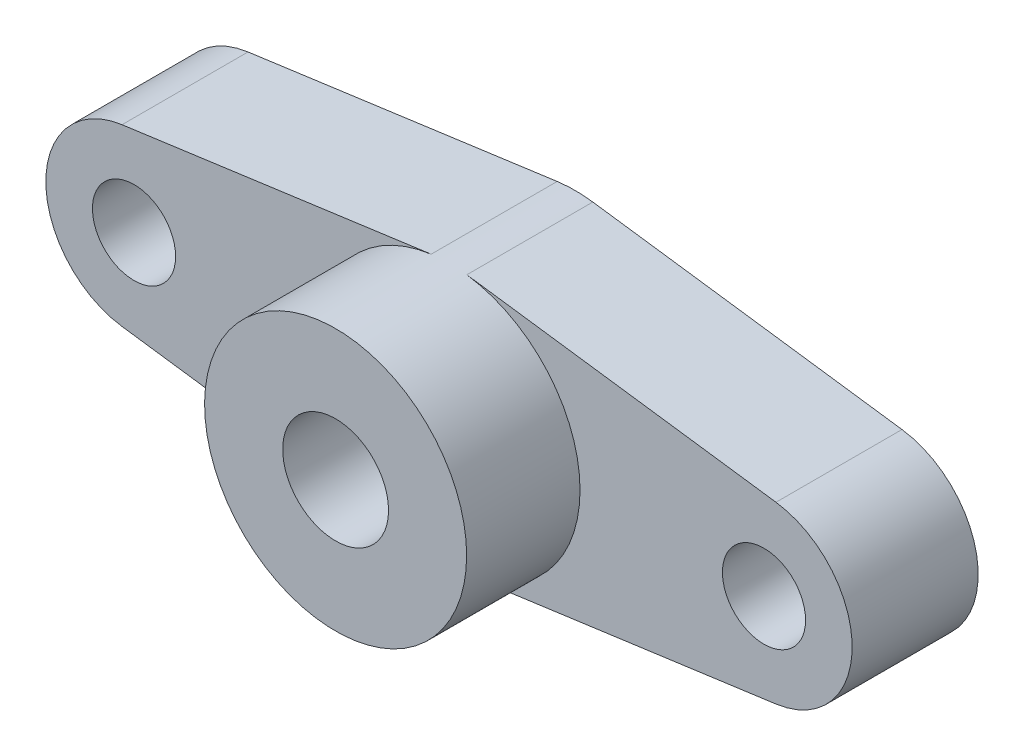
ISO-10303-21;
HEADER;
FILE_DESCRIPTION(('STEP AP214'),'2;1');
FILE_NAME('part.step','',(''),(''),'','','');
FILE_SCHEMA(('AUTOMOTIVE_DESIGN { 1 0 10303 214 1 1 1 1 }'));
ENDSEC;
DATA;
#1=APPLICATION_CONTEXT('core data for automotive mechanical design processes');
#2=APPLICATION_PROTOCOL_DEFINITION('international standard','automotive_design',2000,#1);
#3=PRODUCT_CONTEXT('',#1,'mechanical');
#4=PRODUCT('Part','Part','',(#3));
#5=PRODUCT_RELATED_PRODUCT_CATEGORY('part','',(#4));
#6=PRODUCT_DEFINITION_FORMATION('','',#4);
#7=PRODUCT_DEFINITION_CONTEXT('part definition',#1,'design');
#8=PRODUCT_DEFINITION('design','',#6,#7);
#9=PRODUCT_DEFINITION_SHAPE('','',#8);
#10=(LENGTH_UNIT() NAMED_UNIT(*) SI_UNIT(.MILLI.,.METRE.));
#11=(NAMED_UNIT(*) PLANE_ANGLE_UNIT() SI_UNIT($,.RADIAN.));
#12=(NAMED_UNIT(*) SI_UNIT($,.STERADIAN.) SOLID_ANGLE_UNIT());
#13=UNCERTAINTY_MEASURE_WITH_UNIT(LENGTH_MEASURE(1.E-05),#10,'distance_accuracy_value','');
#14=(GEOMETRIC_REPRESENTATION_CONTEXT(3) GLOBAL_UNCERTAINTY_ASSIGNED_CONTEXT((#13)) GLOBAL_UNIT_ASSIGNED_CONTEXT((#10,
#11,#12)) REPRESENTATION_CONTEXT('',''));
#15=CARTESIAN_POINT('',(0.,0.,0.));
#16=DIRECTION('',(0.,0.,1.));
#17=DIRECTION('',(1.,0.,0.));
#18=AXIS2_PLACEMENT_3D('',#15,#16,#17);
#19=CARTESIAN_POINT('',(0.,0.,0.));
#20=DIRECTION('',(0.,0.,-1.));
#21=DIRECTION('',(-1.,0.,0.));
#22=AXIS2_PLACEMENT_3D('',#19,#20,#21);
#23=PLANE('',#22);
#24=CARTESIAN_POINT('',(0.,0.,0.));
#25=DIRECTION('',(0.,0.,-1.));
#26=DIRECTION('',(-1.,0.,0.));
#27=AXIS2_PLACEMENT_3D('',#24,#25,#26);
#28=CIRCLE('',#27,2.1);
#29=CARTESIAN_POINT('',(-2.1,0.,0.));
#30=VERTEX_POINT('',#29);
#31=EDGE_CURVE('E133',#30,#30,#28,.T.);
#32=ORIENTED_EDGE('',*,*,#31,.F.);
#33=EDGE_LOOP('',(#32));
#34=FACE_BOUND('',#33,.T.);
#35=CARTESIAN_POINT('',(-12.5,0.,0.));
#36=DIRECTION('',(0.,0.,-1.));
#37=DIRECTION('',(-1.,0.,0.));
#38=AXIS2_PLACEMENT_3D('',#35,#36,#37);
#39=CIRCLE('',#38,1.65);
#40=CARTESIAN_POINT('',(-14.15,0.,0.));
#41=VERTEX_POINT('',#40);
#42=EDGE_CURVE('E273',#41,#41,#39,.T.);
#43=ORIENTED_EDGE('',*,*,#42,.F.);
#44=EDGE_LOOP('',(#43));
#45=FACE_BOUND('',#44,.T.);
#46=CARTESIAN_POINT('',(12.5,0.,0.));
#47=DIRECTION('',(0.,0.,-1.));
#48=DIRECTION('',(-1.,0.,0.));
#49=AXIS2_PLACEMENT_3D('',#46,#47,#48);
#50=CIRCLE('',#49,1.65);
#51=CARTESIAN_POINT('',(10.85,0.,0.));
#52=VERTEX_POINT('',#51);
#53=EDGE_CURVE('E217',#52,#52,#50,.T.);
#54=ORIENTED_EDGE('',*,*,#53,.F.);
#55=EDGE_LOOP('',(#54));
#56=FACE_BOUND('',#55,.T.);
#57=DIRECTION('',(-0.990708837146414,0.136,0.));
#58=VECTOR('',#57,1.);
#59=CARTESIAN_POINT('',(0.707199999999998,5.15168595316135,0.));
#60=LINE('',#59,#58);
#61=CARTESIAN_POINT('',(12.976,3.46748093001246,0.));
#62=VERTEX_POINT('',#61);
#63=CARTESIAN_POINT('',(0.707199999999998,5.15168595316135,0.));
#64=VERTEX_POINT('',#63);
#65=EDGE_CURVE('E205',#62,#64,#60,.T.);
#66=ORIENTED_EDGE('',*,*,#65,.F.);
#67=CARTESIAN_POINT('',(12.5,0.,0.));
#68=DIRECTION('',(0.,0.,-1.));
#69=DIRECTION('',(-1.,0.,0.));
#70=AXIS2_PLACEMENT_3D('',#67,#68,#69);
#71=CIRCLE('',#70,3.5);
#72=CARTESIAN_POINT('',(12.976,-3.46748093001244,0.));
#73=VERTEX_POINT('',#72);
#74=EDGE_CURVE('E229',#62,#73,#71,.T.);
#75=ORIENTED_EDGE('',*,*,#74,.T.);
#76=DIRECTION('',(-0.990708837146414,-0.136,0.));
#77=VECTOR('',#76,1.);
#78=CARTESIAN_POINT('',(0.707200000000002,-5.15168595316135,0.));
#79=LINE('',#78,#77);
#80=CARTESIAN_POINT('',(0.707200000000002,-5.15168595316135,0.));
#81=VERTEX_POINT('',#80);
#82=EDGE_CURVE('E12',#73,#81,#79,.T.);
#83=ORIENTED_EDGE('',*,*,#82,.T.);
#84=CARTESIAN_POINT('',(0.,0.,0.));
#85=DIRECTION('',(0.,0.,-1.));
#86=DIRECTION('',(-1.,0.,0.));
#87=AXIS2_PLACEMENT_3D('',#84,#85,#86);
#88=CIRCLE('',#87,5.2);
#89=CARTESIAN_POINT('',(-0.7072,-5.15168595316135,0.));
#90=VERTEX_POINT('',#89);
#91=EDGE_CURVE('E241',#81,#90,#88,.T.);
#92=ORIENTED_EDGE('',*,*,#91,.T.);
#93=DIRECTION('',(-0.990708837146414,0.136,0.));
#94=VECTOR('',#93,1.);
#95=CARTESIAN_POINT('',(-0.7072,-5.15168595316135,0.));
#96=LINE('',#95,#94);
#97=CARTESIAN_POINT('',(-12.976,-3.46748093001245,0.));
#98=VERTEX_POINT('',#97);
#99=EDGE_CURVE('E255',#90,#98,#96,.T.);
#100=ORIENTED_EDGE('',*,*,#99,.T.);
#101=CARTESIAN_POINT('',(-12.5,0.,0.));
#102=DIRECTION('',(0.,0.,-1.));
#103=DIRECTION('',(-1.,0.,0.));
#104=AXIS2_PLACEMENT_3D('',#101,#102,#103);
#105=CIRCLE('',#104,3.5);
#106=CARTESIAN_POINT('',(-12.976,3.46748093001245,0.));
#107=VERTEX_POINT('',#106);
#108=EDGE_CURVE('E236',#98,#107,#105,.T.);
#109=ORIENTED_EDGE('',*,*,#108,.T.);
#110=DIRECTION('',(0.990708837146414,0.136,0.));
#111=VECTOR('',#110,1.);
#112=CARTESIAN_POINT('',(-0.7072,5.15168595316135,0.));
#113=LINE('',#112,#111);
#114=CARTESIAN_POINT('',(-0.7072,5.15168595316135,0.));
#115=VERTEX_POINT('',#114);
#116=EDGE_CURVE('E138',#107,#115,#113,.T.);
#117=ORIENTED_EDGE('',*,*,#116,.T.);
#118=CARTESIAN_POINT('',(0.,0.,0.));
#119=DIRECTION('',(0.,0.,-1.));
#120=DIRECTION('',(-1.,0.,0.));
#121=AXIS2_PLACEMENT_3D('',#118,#119,#120);
#122=CIRCLE('',#121,5.2);
#123=EDGE_CURVE('E233',#64,#115,#122,.F.);
#124=ORIENTED_EDGE('',*,*,#123,.F.);
#125=EDGE_LOOP('',(#66,#75,#83,#92,#100,#109,#117,#124));
#126=FACE_BOUND('',#125,.T.);
#127=ADVANCED_FACE('F130',(#34,#45,#56,#126),#23,.T.);
#128=CARTESIAN_POINT('',(0.,0.,5.));
#129=DIRECTION('',(0.,0.,-1.));
#130=DIRECTION('',(-1.,0.,0.));
#131=AXIS2_PLACEMENT_3D('',#128,#129,#130);
#132=PLANE('',#131);
#133=CARTESIAN_POINT('',(12.5,0.,5.));
#134=DIRECTION('',(0.,0.,1.));
#135=DIRECTION('',(1.,0.,0.));
#136=AXIS2_PLACEMENT_3D('',#133,#134,#135);
#137=CIRCLE('',#136,1.65);
#138=CARTESIAN_POINT('',(14.15,0.,5.));
#139=VERTEX_POINT('',#138);
#140=EDGE_CURVE('E270',#139,#139,#137,.T.);
#141=ORIENTED_EDGE('',*,*,#140,.F.);
#142=EDGE_LOOP('',(#141));
#143=FACE_BOUND('',#142,.T.);
#144=CARTESIAN_POINT('',(12.5,0.,5.));
#145=DIRECTION('',(0.,0.,1.));
#146=DIRECTION('',(1.,0.,0.));
#147=AXIS2_PLACEMENT_3D('',#144,#145,#146);
#148=CIRCLE('',#147,3.5);
#149=CARTESIAN_POINT('',(12.976,-3.46748093001244,5.));
#150=VERTEX_POINT('',#149);
#151=CARTESIAN_POINT('',(12.976,3.46748093001246,5.));
#152=VERTEX_POINT('',#151);
#153=EDGE_CURVE('E215',#150,#152,#148,.T.);
#154=ORIENTED_EDGE('',*,*,#153,.T.);
#155=DIRECTION('',(0.990708837146414,-0.136,0.));
#156=VECTOR('',#155,1.);
#157=CARTESIAN_POINT('',(0.707199999999998,5.15168595316135,5.));
#158=LINE('',#157,#156);
#159=CARTESIAN_POINT('',(0.707199999999998,5.15168595316135,5.));
#160=VERTEX_POINT('',#159);
#161=EDGE_CURVE('E203',#160,#152,#158,.T.);
#162=ORIENTED_EDGE('',*,*,#161,.F.);
#163=CARTESIAN_POINT('',(0.,0.,5.));
#164=DIRECTION('',(0.,0.,1.));
#165=DIRECTION('',(1.,0.,0.));
#166=AXIS2_PLACEMENT_3D('',#163,#164,#165);
#167=CIRCLE('',#166,5.2);
#168=CARTESIAN_POINT('',(0.707200000000002,-5.15168595316135,5.));
#169=VERTEX_POINT('',#168);
#170=EDGE_CURVE('E213',#169,#160,#167,.T.);
#171=ORIENTED_EDGE('',*,*,#170,.F.);
#172=DIRECTION('',(0.990708837146414,0.136,0.));
#173=VECTOR('',#172,1.);
#174=CARTESIAN_POINT('',(0.707200000000002,-5.15168595316135,5.));
#175=LINE('',#174,#173);
#176=EDGE_CURVE('E146',#169,#150,#175,.T.);
#177=ORIENTED_EDGE('',*,*,#176,.T.);
#178=EDGE_LOOP('',(#154,#162,#171,#177));
#179=FACE_BOUND('',#178,.T.);
#180=ADVANCED_FACE('F212',(#143,#179),#132,.F.);
#181=CARTESIAN_POINT('',(-12.5,0.,5.));
#182=DIRECTION('',(0.,0.,1.));
#183=DIRECTION('',(1.,0.,0.));
#184=AXIS2_PLACEMENT_3D('',#181,#182,#183);
#185=CIRCLE('',#184,1.65);
#186=CARTESIAN_POINT('',(-10.85,0.,5.));
#187=VERTEX_POINT('',#186);
#188=EDGE_CURVE('E274',#187,#187,#185,.T.);
#189=ORIENTED_EDGE('',*,*,#188,.F.);
#190=EDGE_LOOP('',(#189));
#191=FACE_BOUND('',#190,.T.);
#192=CARTESIAN_POINT('',(-12.5,0.,5.));
#193=DIRECTION('',(0.,0.,1.));
#194=DIRECTION('',(1.,0.,0.));
#195=AXIS2_PLACEMENT_3D('',#192,#193,#194);
#196=CIRCLE('',#195,3.5);
#197=CARTESIAN_POINT('',(-12.976,3.46748093001245,5.));
#198=VERTEX_POINT('',#197);
#199=CARTESIAN_POINT('',(-12.976,-3.46748093001245,5.));
#200=VERTEX_POINT('',#199);
#201=EDGE_CURVE('E248',#198,#200,#196,.T.);
#202=ORIENTED_EDGE('',*,*,#201,.T.);
#203=DIRECTION('',(0.990708837146414,-0.136,0.));
#204=VECTOR('',#203,1.);
#205=CARTESIAN_POINT('',(-0.7072,-5.15168595316135,5.));
#206=LINE('',#205,#204);
#207=CARTESIAN_POINT('',(-0.7072,-5.15168595316135,5.));
#208=VERTEX_POINT('',#207);
#209=EDGE_CURVE('E261',#200,#208,#206,.T.);
#210=ORIENTED_EDGE('',*,*,#209,.T.);
#211=CARTESIAN_POINT('',(-0.7072,5.15168595316135,5.));
#212=VERTEX_POINT('',#211);
#213=EDGE_CURVE('E223',#212,#208,#167,.T.);
#214=ORIENTED_EDGE('',*,*,#213,.F.);
#215=DIRECTION('',(-0.990708837146414,-0.136,0.));
#216=VECTOR('',#215,1.);
#217=CARTESIAN_POINT('',(-0.7072,5.15168595316135,5.));
#218=LINE('',#217,#216);
#219=EDGE_CURVE('E154',#212,#198,#218,.T.);
#220=ORIENTED_EDGE('',*,*,#219,.T.);
#221=EDGE_LOOP('',(#202,#210,#214,#220));
#222=FACE_BOUND('',#221,.T.);
#223=ADVANCED_FACE('F323',(#191,#222),#132,.F.);
#224=CARTESIAN_POINT('',(0.,0.,9.5));
#225=DIRECTION('',(0.,0.,-1.));
#226=DIRECTION('',(-1.,0.,0.));
#227=AXIS2_PLACEMENT_3D('',#224,#225,#226);
#228=CYLINDRICAL_SURFACE('',#227,5.2);
#229=CARTESIAN_POINT('',(0.,0.,9.5));
#230=DIRECTION('',(0.,0.,1.));
#231=DIRECTION('',(1.,0.,0.));
#232=AXIS2_PLACEMENT_3D('',#229,#230,#231);
#233=CIRCLE('',#232,5.2);
#234=CARTESIAN_POINT('',(5.2,0.,9.5));
#235=VERTEX_POINT('',#234);
#236=EDGE_CURVE('E221',#235,#235,#233,.T.);
#237=ORIENTED_EDGE('',*,*,#236,.F.);
#238=EDGE_LOOP('',(#237));
#239=FACE_BOUND('',#238,.T.);
#240=ORIENTED_EDGE('',*,*,#170,.T.);
#241=DIRECTION('',(0.,0.,1.));
#242=VECTOR('',#241,1.);
#243=CARTESIAN_POINT('',(0.707199999999998,5.15168595316135,-0.3));
#244=LINE('',#243,#242);
#245=EDGE_CURVE('E199',#64,#160,#244,.T.);
#246=ORIENTED_EDGE('',*,*,#245,.F.);
#247=ORIENTED_EDGE('',*,*,#123,.T.);
#248=DIRECTION('',(0.,0.,1.));
#249=VECTOR('',#248,1.);
#250=CARTESIAN_POINT('',(-0.7072,5.15168595316135,-0.3));
#251=LINE('',#250,#249);
#252=EDGE_CURVE('E243',#115,#212,#251,.T.);
#253=ORIENTED_EDGE('',*,*,#252,.T.);
#254=ORIENTED_EDGE('',*,*,#213,.T.);
#255=DIRECTION('',(0.,0.,1.));
#256=VECTOR('',#255,1.);
#257=CARTESIAN_POINT('',(-0.7072,-5.15168595316135,-0.3));
#258=LINE('',#257,#256);
#259=EDGE_CURVE('E259',#90,#208,#258,.T.);
#260=ORIENTED_EDGE('',*,*,#259,.F.);
#261=ORIENTED_EDGE('',*,*,#91,.F.);
#262=DIRECTION('',(0.,0.,1.));
#263=VECTOR('',#262,1.);
#264=CARTESIAN_POINT('',(0.707200000000002,-5.15168595316135,-0.3));
#265=LINE('',#264,#263);
#266=EDGE_CURVE('E220',#81,#169,#265,.T.);
#267=ORIENTED_EDGE('',*,*,#266,.T.);
#268=EDGE_LOOP('',(#240,#246,#247,#253,#254,#260,#261,#267));
#269=FACE_BOUND('',#268,.T.);
#270=ADVANCED_FACE('F219',(#239,#269),#228,.T.);
#271=CARTESIAN_POINT('',(0.,0.,9.5));
#272=DIRECTION('',(0.,0.,1.));
#273=DIRECTION('',(1.,0.,0.));
#274=AXIS2_PLACEMENT_3D('',#271,#272,#273);
#275=PLANE('',#274);
#276=CARTESIAN_POINT('',(0.,0.,9.5));
#277=DIRECTION('',(0.,0.,1.));
#278=DIRECTION('',(1.,0.,0.));
#279=AXIS2_PLACEMENT_3D('',#276,#277,#278);
#280=CIRCLE('',#279,2.1);
#281=CARTESIAN_POINT('',(2.1,0.,9.5));
#282=VERTEX_POINT('',#281);
#283=EDGE_CURVE('E277',#282,#282,#280,.T.);
#284=ORIENTED_EDGE('',*,*,#283,.F.);
#285=EDGE_LOOP('',(#284));
#286=FACE_BOUND('',#285,.T.);
#287=ORIENTED_EDGE('',*,*,#236,.T.);
#288=EDGE_LOOP('',(#287));
#289=FACE_BOUND('',#288,.T.);
#290=ADVANCED_FACE('F318',(#286,#289),#275,.T.);
#291=CARTESIAN_POINT('',(-12.5,0.,-0.3));
#292=DIRECTION('',(0.,0.,1.));
#293=DIRECTION('',(1.,0.,0.));
#294=AXIS2_PLACEMENT_3D('',#291,#292,#293);
#295=CYLINDRICAL_SURFACE('',#294,3.5);
#296=ORIENTED_EDGE('',*,*,#108,.F.);
#297=DIRECTION('',(0.,0.,1.));
#298=VECTOR('',#297,1.);
#299=CARTESIAN_POINT('',(-12.976,-3.46748093001245,-0.3));
#300=LINE('',#299,#298);
#301=EDGE_CURVE('E258',#98,#200,#300,.T.);
#302=ORIENTED_EDGE('',*,*,#301,.T.);
#303=ORIENTED_EDGE('',*,*,#201,.F.);
#304=DIRECTION('',(0.,0.,1.));
#305=VECTOR('',#304,1.);
#306=CARTESIAN_POINT('',(-12.976,3.46748093001245,-0.3));
#307=LINE('',#306,#305);
#308=EDGE_CURVE('E244',#107,#198,#307,.T.);
#309=ORIENTED_EDGE('',*,*,#308,.F.);
#310=EDGE_LOOP('',(#296,#302,#303,#309));
#311=FACE_BOUND('',#310,.T.);
#312=ADVANCED_FACE('F296',(#311),#295,.T.);
#313=CARTESIAN_POINT('',(-0.7072,5.15168595316135,-0.3));
#314=DIRECTION('',(-0.136,0.990708837146414,0.));
#315=DIRECTION('',(-0.990708837146414,-0.136,0.));
#316=AXIS2_PLACEMENT_3D('',#313,#314,#315);
#317=PLANE('',#316);
#318=ORIENTED_EDGE('',*,*,#308,.T.);
#319=ORIENTED_EDGE('',*,*,#219,.F.);
#320=ORIENTED_EDGE('',*,*,#252,.F.);
#321=ORIENTED_EDGE('',*,*,#116,.F.);
#322=EDGE_LOOP('',(#318,#319,#320,#321));
#323=FACE_BOUND('',#322,.T.);
#324=ADVANCED_FACE('F292',(#323),#317,.T.);
#325=CARTESIAN_POINT('',(12.5,0.,-0.3));
#326=DIRECTION('',(0.,0.,1.));
#327=DIRECTION('',(1.,0.,0.));
#328=AXIS2_PLACEMENT_3D('',#325,#326,#327);
#329=CYLINDRICAL_SURFACE('',#328,3.5);
#330=ORIENTED_EDGE('',*,*,#74,.F.);
#331=DIRECTION('',(0.,0.,1.));
#332=VECTOR('',#331,1.);
#333=CARTESIAN_POINT('',(12.976,3.46748093001246,-0.3));
#334=LINE('',#333,#332);
#335=EDGE_CURVE('E208',#62,#152,#334,.T.);
#336=ORIENTED_EDGE('',*,*,#335,.T.);
#337=ORIENTED_EDGE('',*,*,#153,.F.);
#338=DIRECTION('',(0.,0.,1.));
#339=VECTOR('',#338,1.);
#340=CARTESIAN_POINT('',(12.976,-3.46748093001244,-0.3));
#341=LINE('',#340,#339);
#342=EDGE_CURVE('E250',#73,#150,#341,.T.);
#343=ORIENTED_EDGE('',*,*,#342,.F.);
#344=EDGE_LOOP('',(#330,#336,#337,#343));
#345=FACE_BOUND('',#344,.T.);
#346=ADVANCED_FACE('F305',(#345),#329,.T.);
#347=CARTESIAN_POINT('',(0.707200000000002,-5.15168595316135,-0.3));
#348=DIRECTION('',(0.136,-0.990708837146414,0.));
#349=DIRECTION('',(0.990708837146414,0.136,0.));
#350=AXIS2_PLACEMENT_3D('',#347,#348,#349);
#351=PLANE('',#350);
#352=ORIENTED_EDGE('',*,*,#342,.T.);
#353=ORIENTED_EDGE('',*,*,#176,.F.);
#354=ORIENTED_EDGE('',*,*,#266,.F.);
#355=ORIENTED_EDGE('',*,*,#82,.F.);
#356=EDGE_LOOP('',(#352,#353,#354,#355));
#357=FACE_BOUND('',#356,.T.);
#358=ADVANCED_FACE('F302',(#357),#351,.T.);
#359=CARTESIAN_POINT('',(-0.7072,-5.15168595316135,-0.3));
#360=DIRECTION('',(-0.136,-0.990708837146414,0.));
#361=DIRECTION('',(0.990708837146414,-0.136,0.));
#362=AXIS2_PLACEMENT_3D('',#359,#360,#361);
#363=PLANE('',#362);
#364=ORIENTED_EDGE('',*,*,#259,.T.);
#365=ORIENTED_EDGE('',*,*,#209,.F.);
#366=ORIENTED_EDGE('',*,*,#301,.F.);
#367=ORIENTED_EDGE('',*,*,#99,.F.);
#368=EDGE_LOOP('',(#364,#365,#366,#367));
#369=FACE_BOUND('',#368,.T.);
#370=ADVANCED_FACE('F300',(#369),#363,.T.);
#371=CARTESIAN_POINT('',(0.707199999999998,5.15168595316135,-0.3));
#372=DIRECTION('',(-0.136,-0.990708837146414,0.));
#373=DIRECTION('',(0.990708837146414,-0.136,0.));
#374=AXIS2_PLACEMENT_3D('',#371,#372,#373);
#375=PLANE('',#374);
#376=ORIENTED_EDGE('',*,*,#65,.T.);
#377=ORIENTED_EDGE('',*,*,#245,.T.);
#378=ORIENTED_EDGE('',*,*,#161,.T.);
#379=ORIENTED_EDGE('',*,*,#335,.F.);
#380=EDGE_LOOP('',(#376,#377,#378,#379));
#381=FACE_BOUND('',#380,.T.);
#382=ADVANCED_FACE('F201',(#381),#375,.F.);
#383=CARTESIAN_POINT('',(12.5,0.,5.));
#384=DIRECTION('',(0.,0.,1.));
#385=DIRECTION('',(1.,0.,0.));
#386=AXIS2_PLACEMENT_3D('',#383,#384,#385);
#387=CYLINDRICAL_SURFACE('',#386,1.65);
#388=ORIENTED_EDGE('',*,*,#53,.T.);
#389=EDGE_LOOP('',(#388));
#390=FACE_BOUND('',#389,.T.);
#391=ORIENTED_EDGE('',*,*,#140,.T.);
#392=EDGE_LOOP('',(#391));
#393=FACE_BOUND('',#392,.T.);
#394=ADVANCED_FACE('F333',(#390,#393),#387,.F.);
#395=CARTESIAN_POINT('',(-12.5,0.,5.));
#396=DIRECTION('',(0.,0.,1.));
#397=DIRECTION('',(1.,0.,0.));
#398=AXIS2_PLACEMENT_3D('',#395,#396,#397);
#399=CYLINDRICAL_SURFACE('',#398,1.65);
#400=ORIENTED_EDGE('',*,*,#42,.T.);
#401=EDGE_LOOP('',(#400));
#402=FACE_BOUND('',#401,.T.);
#403=ORIENTED_EDGE('',*,*,#188,.T.);
#404=EDGE_LOOP('',(#403));
#405=FACE_BOUND('',#404,.T.);
#406=ADVANCED_FACE('F335',(#402,#405),#399,.F.);
#407=CARTESIAN_POINT('',(0.,0.,9.5));
#408=DIRECTION('',(0.,0.,1.));
#409=DIRECTION('',(1.,0.,0.));
#410=AXIS2_PLACEMENT_3D('',#407,#408,#409);
#411=CYLINDRICAL_SURFACE('',#410,2.1);
#412=ORIENTED_EDGE('',*,*,#31,.T.);
#413=EDGE_LOOP('',(#412));
#414=FACE_BOUND('',#413,.T.);
#415=ORIENTED_EDGE('',*,*,#283,.T.);
#416=EDGE_LOOP('',(#415));
#417=FACE_BOUND('',#416,.T.);
#418=ADVANCED_FACE('F284',(#414,#417),#411,.F.);
#419=CLOSED_SHELL('',(#127,#180,#223,#270,#290,#312,#324,#346,#358,#370,#382,#394,#406,#418));
#420=MANIFOLD_SOLID_BREP('B2',#419);
#421=ADVANCED_BREP_SHAPE_REPRESENTATION('',(#18,#420),#14);
#422=SHAPE_DEFINITION_REPRESENTATION(#9,#421);
ENDSEC;
END-ISO-10303-21;
